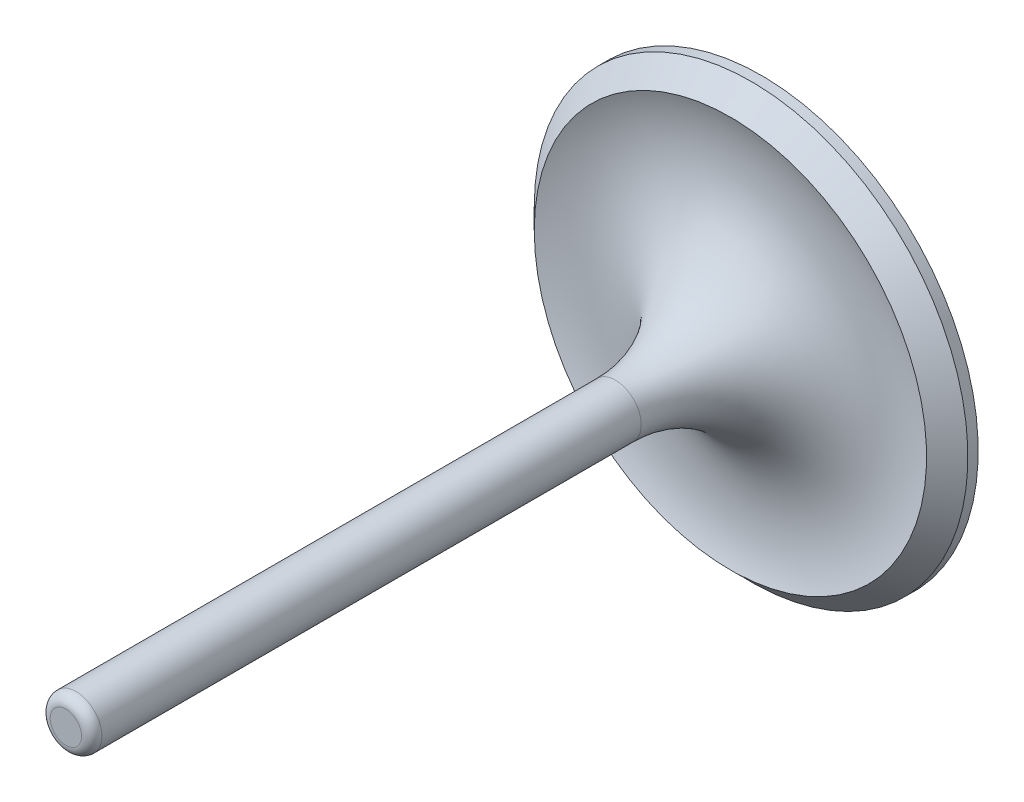
ISO-10303-21;
HEADER;
FILE_DESCRIPTION(('STEP AP214'),'2;1');
FILE_NAME('part.step','',(''),(''),'','','');
FILE_SCHEMA(('AUTOMOTIVE_DESIGN { 1 0 10303 214 1 1 1 1 }'));
ENDSEC;
DATA;
#1=APPLICATION_CONTEXT('core data for automotive mechanical design processes');
#2=APPLICATION_PROTOCOL_DEFINITION('international standard','automotive_design',2000,#1);
#3=PRODUCT_CONTEXT('',#1,'mechanical');
#4=PRODUCT('Part','Part','',(#3));
#5=PRODUCT_RELATED_PRODUCT_CATEGORY('part','',(#4));
#6=PRODUCT_DEFINITION_FORMATION('','',#4);
#7=PRODUCT_DEFINITION_CONTEXT('part definition',#1,'design');
#8=PRODUCT_DEFINITION('design','',#6,#7);
#9=PRODUCT_DEFINITION_SHAPE('','',#8);
#10=(LENGTH_UNIT() NAMED_UNIT(*) SI_UNIT(.MILLI.,.METRE.));
#11=(NAMED_UNIT(*) PLANE_ANGLE_UNIT() SI_UNIT($,.RADIAN.));
#12=(NAMED_UNIT(*) SI_UNIT($,.STERADIAN.) SOLID_ANGLE_UNIT());
#13=UNCERTAINTY_MEASURE_WITH_UNIT(LENGTH_MEASURE(1.E-05),#10,'distance_accuracy_value','');
#14=(GEOMETRIC_REPRESENTATION_CONTEXT(3) GLOBAL_UNCERTAINTY_ASSIGNED_CONTEXT((#13)) GLOBAL_UNIT_ASSIGNED_CONTEXT((#10,
#11,#12)) REPRESENTATION_CONTEXT('',''));
#15=CARTESIAN_POINT('',(0.,0.,0.));
#16=DIRECTION('',(0.,0.,1.));
#17=DIRECTION('',(1.,0.,0.));
#18=AXIS2_PLACEMENT_3D('',#15,#16,#17);
#19=CARTESIAN_POINT('',(0.,26.67,0.));
#20=DIRECTION('',(0.,0.,-1.));
#21=DIRECTION('',(-1.,0.,0.));
#22=AXIS2_PLACEMENT_3D('',#19,#20,#21);
#23=PLANE('',#22);
#24=CARTESIAN_POINT('',(0.,0.,0.));
#25=DIRECTION('',(0.,0.,-1.));
#26=DIRECTION('',(-1.,0.,0.));
#27=AXIS2_PLACEMENT_3D('',#24,#25,#26);
#28=CIRCLE('',#27,26.67);
#29=CARTESIAN_POINT('',(-26.67,0.,0.));
#30=VERTEX_POINT('',#29);
#31=EDGE_CURVE('E58',#30,#30,#28,.T.);
#32=ORIENTED_EDGE('',*,*,#31,.T.);
#33=EDGE_LOOP('',(#32));
#34=FACE_BOUND('',#33,.T.);
#35=ADVANCED_FACE('F45',(#34),#23,.T.);
#36=CARTESIAN_POINT('',(0.,0.,0.));
#37=DIRECTION('',(0.,0.,-1.));
#38=DIRECTION('',(-1.,0.,0.));
#39=AXIS2_PLACEMENT_3D('',#36,#37,#38);
#40=CYLINDRICAL_SURFACE('',#39,26.67);
#41=CARTESIAN_POINT('',(0.,0.,1.27));
#42=DIRECTION('',(0.,0.,-1.));
#43=DIRECTION('',(-1.,0.,0.));
#44=AXIS2_PLACEMENT_3D('',#41,#42,#43);
#45=CIRCLE('',#44,26.67);
#46=CARTESIAN_POINT('',(-26.67,0.,1.27));
#47=VERTEX_POINT('',#46);
#48=EDGE_CURVE('E63',#47,#47,#45,.T.);
#49=ORIENTED_EDGE('',*,*,#48,.T.);
#50=EDGE_LOOP('',(#49));
#51=FACE_BOUND('',#50,.T.);
#52=ORIENTED_EDGE('',*,*,#31,.F.);
#53=EDGE_LOOP('',(#52));
#54=FACE_BOUND('',#53,.T.);
#55=ADVANCED_FACE('F93',(#51,#54),#40,.T.);
#56=CARTESIAN_POINT('',(0.,0.,1.27));
#57=DIRECTION('',(0.,0.,-1.));
#58=DIRECTION('',(-1.,0.,0.));
#59=AXIS2_PLACEMENT_3D('',#56,#57,#58);
#60=CONICAL_SURFACE('',#59,26.67,0.785398163397453);
#61=CARTESIAN_POINT('',(0.,0.,3.81));
#62=DIRECTION('',(0.,0.,-1.));
#63=DIRECTION('',(-1.,0.,0.));
#64=AXIS2_PLACEMENT_3D('',#61,#62,#63);
#65=CIRCLE('',#64,24.13);
#66=CARTESIAN_POINT('',(-24.13,0.,3.81));
#67=VERTEX_POINT('',#66);
#68=EDGE_CURVE('E69',#67,#67,#65,.T.);
#69=ORIENTED_EDGE('',*,*,#68,.T.);
#70=EDGE_LOOP('',(#69));
#71=FACE_BOUND('',#70,.T.);
#72=ORIENTED_EDGE('',*,*,#48,.F.);
#73=EDGE_LOOP('',(#72));
#74=FACE_BOUND('',#73,.T.);
#75=ADVANCED_FACE('F90',(#71,#74),#60,.T.);
#76=CARTESIAN_POINT('',(0.,0.,17.9546986535592));
#77=DIRECTION('',(0.,0.,-1.));
#78=DIRECTION('',(-1.,0.,0.));
#79=AXIS2_PLACEMENT_3D('',#76,#77,#78);
#80=TOROIDAL_SURFACE('',#79,18.43,15.25);
#81=CARTESIAN_POINT('',(0.,0.,17.9546986535592));
#82=DIRECTION('',(0.,0.,-1.));
#83=DIRECTION('',(-1.,0.,0.));
#84=AXIS2_PLACEMENT_3D('',#81,#82,#83);
#85=CIRCLE('',#84,3.18000000000001);
#86=CARTESIAN_POINT('',(-3.18000000000001,0.,17.9546986535592));
#87=VERTEX_POINT('',#86);
#88=EDGE_CURVE('E73',#87,#87,#85,.T.);
#89=ORIENTED_EDGE('',*,*,#88,.T.);
#90=EDGE_LOOP('',(#89));
#91=FACE_BOUND('',#90,.T.);
#92=ORIENTED_EDGE('',*,*,#68,.F.);
#93=EDGE_LOOP('',(#92));
#94=FACE_BOUND('',#93,.T.);
#95=ADVANCED_FACE('F78',(#91,#94),#80,.F.);
#96=CARTESIAN_POINT('',(0.,0.,0.));
#97=DIRECTION('',(0.,0.,-1.));
#98=DIRECTION('',(-1.,0.,0.));
#99=AXIS2_PLACEMENT_3D('',#96,#97,#98);
#100=CYLINDRICAL_SURFACE('',#99,3.18000000000001);
#101=CARTESIAN_POINT('',(0.,0.,84.3));
#102=DIRECTION('',(0.,0.,1.));
#103=DIRECTION('',(1.,0.,0.));
#104=AXIS2_PLACEMENT_3D('',#101,#102,#103);
#105=CIRCLE('',#104,3.18000000000001);
#106=CARTESIAN_POINT('',(3.18000000000001,0.,84.3));
#107=VERTEX_POINT('',#106);
#108=EDGE_CURVE('E53',#107,#107,#105,.F.);
#109=ORIENTED_EDGE('',*,*,#108,.T.);
#110=EDGE_LOOP('',(#109));
#111=FACE_BOUND('',#110,.T.);
#112=ORIENTED_EDGE('',*,*,#88,.F.);
#113=EDGE_LOOP('',(#112));
#114=FACE_BOUND('',#113,.T.);
#115=ADVANCED_FACE('F81',(#111,#114),#100,.T.);
#116=CARTESIAN_POINT('',(0.,0.,85.55));
#117=DIRECTION('',(0.,0.,1.));
#118=DIRECTION('',(1.,0.,0.));
#119=AXIS2_PLACEMENT_3D('',#116,#117,#118);
#120=PLANE('',#119);
#121=CARTESIAN_POINT('',(0.,0.,85.55));
#122=DIRECTION('',(0.,0.,1.));
#123=DIRECTION('',(1.,0.,0.));
#124=AXIS2_PLACEMENT_3D('',#121,#122,#123);
#125=CIRCLE('',#124,1.93);
#126=CARTESIAN_POINT('',(1.93,0.,85.55));
#127=VERTEX_POINT('',#126);
#128=EDGE_CURVE('E10',#127,#127,#125,.T.);
#129=ORIENTED_EDGE('',*,*,#128,.T.);
#130=EDGE_LOOP('',(#129));
#131=FACE_BOUND('',#130,.T.);
#132=ADVANCED_FACE('F83',(#131),#120,.T.);
#133=CARTESIAN_POINT('',(0.,0.,84.3));
#134=DIRECTION('',(0.,0.,1.));
#135=DIRECTION('',(1.,0.,0.));
#136=AXIS2_PLACEMENT_3D('',#133,#134,#135);
#137=TOROIDAL_SURFACE('',#136,1.93,1.25);
#138=ORIENTED_EDGE('',*,*,#128,.F.);
#139=EDGE_LOOP('',(#138));
#140=FACE_BOUND('',#139,.T.);
#141=ORIENTED_EDGE('',*,*,#108,.F.);
#142=EDGE_LOOP('',(#141));
#143=FACE_BOUND('',#142,.T.);
#144=ADVANCED_FACE('F47',(#140,#143),#137,.T.);
#145=CLOSED_SHELL('',(#35,#55,#75,#95,#115,#132,#144));
#146=MANIFOLD_SOLID_BREP('B2',#145);
#147=ADVANCED_BREP_SHAPE_REPRESENTATION('',(#18,#146),#14);
#148=SHAPE_DEFINITION_REPRESENTATION(#9,#147);
ENDSEC;
END-ISO-10303-21;
